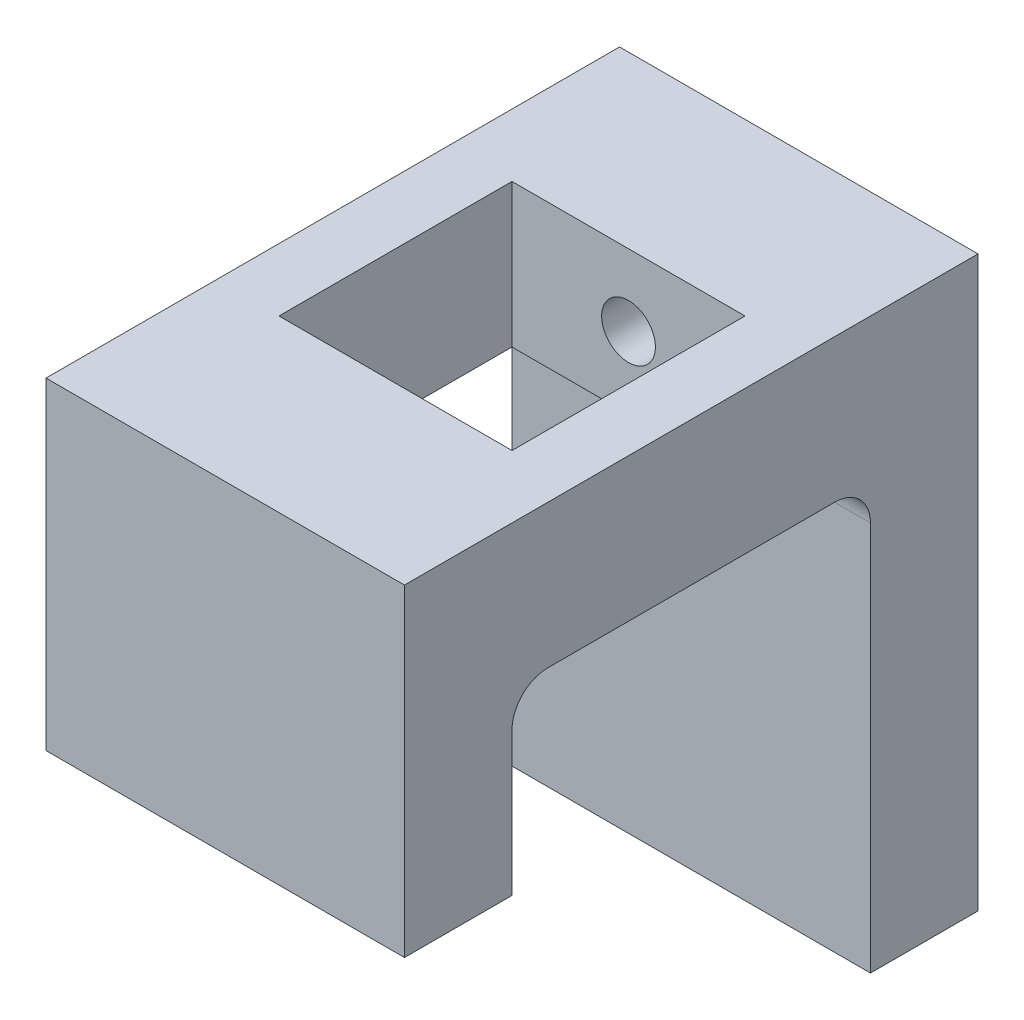
ISO-10303-21;
HEADER;
FILE_DESCRIPTION(('STEP AP214'),'2;1');
FILE_NAME('part.step','',(''),(''),'','','');
FILE_SCHEMA(('AUTOMOTIVE_DESIGN { 1 0 10303 214 1 1 1 1 }'));
ENDSEC;
DATA;
#1=APPLICATION_CONTEXT('core data for automotive mechanical design processes');
#2=APPLICATION_PROTOCOL_DEFINITION('international standard','automotive_design',2000,#1);
#3=PRODUCT_CONTEXT('',#1,'mechanical');
#4=PRODUCT('Part','Part','',(#3));
#5=PRODUCT_RELATED_PRODUCT_CATEGORY('part','',(#4));
#6=PRODUCT_DEFINITION_FORMATION('','',#4);
#7=PRODUCT_DEFINITION_CONTEXT('part definition',#1,'design');
#8=PRODUCT_DEFINITION('design','',#6,#7);
#9=PRODUCT_DEFINITION_SHAPE('','',#8);
#10=(LENGTH_UNIT() NAMED_UNIT(*) SI_UNIT(.MILLI.,.METRE.));
#11=(NAMED_UNIT(*) PLANE_ANGLE_UNIT() SI_UNIT($,.RADIAN.));
#12=(NAMED_UNIT(*) SI_UNIT($,.STERADIAN.) SOLID_ANGLE_UNIT());
#13=UNCERTAINTY_MEASURE_WITH_UNIT(LENGTH_MEASURE(1.E-05),#10,'distance_accuracy_value','');
#14=(GEOMETRIC_REPRESENTATION_CONTEXT(3) GLOBAL_UNCERTAINTY_ASSIGNED_CONTEXT((#13)) GLOBAL_UNIT_ASSIGNED_CONTEXT((#10,
#11,#12)) REPRESENTATION_CONTEXT('',''));
#15=CARTESIAN_POINT('',(0.,0.,0.));
#16=DIRECTION('',(0.,0.,1.));
#17=DIRECTION('',(1.,0.,0.));
#18=AXIS2_PLACEMENT_3D('',#15,#16,#17);
#19=CARTESIAN_POINT('',(-27.5,75.,3.));
#20=DIRECTION('',(0.,0.,-1.));
#21=DIRECTION('',(-1.,0.,0.));
#22=AXIS2_PLACEMENT_3D('',#19,#20,#21);
#23=PLANE('',#22);
#24=DIRECTION('',(0.,-1.,0.));
#25=VECTOR('',#24,1.);
#26=CARTESIAN_POINT('',(-27.5,75.,3.));
#27=LINE('',#26,#25);
#28=CARTESIAN_POINT('',(-27.5,65.,3.));
#29=VERTEX_POINT('',#28);
#30=CARTESIAN_POINT('',(-27.5,43.25,3.00000000000001));
#31=VERTEX_POINT('',#30);
#32=EDGE_CURVE('E152',#29,#31,#27,.T.);
#33=ORIENTED_EDGE('',*,*,#32,.T.);
#34=DIRECTION('',(1.,0.,0.));
#35=VECTOR('',#34,1.);
#36=CARTESIAN_POINT('',(-27.5,43.25,3.00000000000001));
#37=LINE('',#36,#35);
#38=CARTESIAN_POINT('',(-7.5,43.25,3.));
#39=VERTEX_POINT('',#38);
#40=EDGE_CURVE('E138',#31,#39,#37,.T.);
#41=ORIENTED_EDGE('',*,*,#40,.T.);
#42=DIRECTION('',(0.,-1.,0.));
#43=VECTOR('',#42,1.);
#44=CARTESIAN_POINT('',(-7.5,75.,3.));
#45=LINE('',#44,#43);
#46=CARTESIAN_POINT('',(-7.5,65.,3.));
#47=VERTEX_POINT('',#46);
#48=EDGE_CURVE('E163',#47,#39,#45,.T.);
#49=ORIENTED_EDGE('',*,*,#48,.F.);
#50=DIRECTION('',(1.,0.,0.));
#51=VECTOR('',#50,1.);
#52=CARTESIAN_POINT('',(-27.5,65.,3.));
#53=LINE('',#52,#51);
#54=EDGE_CURVE('E160',#47,#29,#53,.F.);
#55=ORIENTED_EDGE('',*,*,#54,.T.);
#56=EDGE_LOOP('',(#33,#41,#49,#55));
#57=FACE_BOUND('',#56,.T.);
#58=ADVANCED_FACE('F39',(#57),#23,.F.);
#59=CARTESIAN_POINT('',(-27.5,75.,-3.));
#60=DIRECTION('',(1.,0.,0.));
#61=DIRECTION('',(0.,0.,-1.));
#62=AXIS2_PLACEMENT_3D('',#59,#60,#61);
#63=PLANE('',#62);
#64=DIRECTION('',(0.,-1.,0.));
#65=VECTOR('',#64,1.);
#66=CARTESIAN_POINT('',(-27.5,75.,-3.));
#67=LINE('',#66,#65);
#68=CARTESIAN_POINT('',(-27.5,75.,-3.));
#69=VERTEX_POINT('',#68);
#70=CARTESIAN_POINT('',(-27.5,43.25,-3.));
#71=VERTEX_POINT('',#70);
#72=EDGE_CURVE('E156',#69,#71,#67,.T.);
#73=ORIENTED_EDGE('',*,*,#72,.T.);
#74=DIRECTION('',(0.,0.,1.));
#75=VECTOR('',#74,1.);
#76=CARTESIAN_POINT('',(-27.5,43.25,3.00000000000001));
#77=LINE('',#76,#75);
#78=EDGE_CURVE('E55',#71,#31,#77,.T.);
#79=ORIENTED_EDGE('',*,*,#78,.T.);
#80=ORIENTED_EDGE('',*,*,#32,.F.);
#81=CARTESIAN_POINT('',(-27.5,65.,5.));
#82=DIRECTION('',(1.,0.,0.));
#83=DIRECTION('',(0.,0.,-1.));
#84=AXIS2_PLACEMENT_3D('',#81,#82,#83);
#85=CIRCLE('',#84,2.);
#86=CARTESIAN_POINT('',(-27.5,67.,5.00000000000001));
#87=VERTEX_POINT('',#86);
#88=EDGE_CURVE('E11',#29,#87,#85,.T.);
#89=ORIENTED_EDGE('',*,*,#88,.T.);
#90=DIRECTION('',(0.,0.,-1.));
#91=VECTOR('',#90,1.);
#92=CARTESIAN_POINT('',(-27.5,67.,29.));
#93=LINE('',#92,#91);
#94=CARTESIAN_POINT('',(-27.5,67.,21.));
#95=VERTEX_POINT('',#94);
#96=EDGE_CURVE('E204',#95,#87,#93,.T.);
#97=ORIENTED_EDGE('',*,*,#96,.F.);
#98=CARTESIAN_POINT('',(-27.5,65.,21.));
#99=DIRECTION('',(1.,0.,0.));
#100=DIRECTION('',(0.,0.,-1.));
#101=AXIS2_PLACEMENT_3D('',#98,#99,#100);
#102=CIRCLE('',#101,2.);
#103=CARTESIAN_POINT('',(-27.5,65.,23.));
#104=VERTEX_POINT('',#103);
#105=EDGE_CURVE('E182',#95,#104,#102,.T.);
#106=ORIENTED_EDGE('',*,*,#105,.T.);
#107=DIRECTION('',(0.,1.,0.));
#108=VECTOR('',#107,1.);
#109=CARTESIAN_POINT('',(-27.5,57.,23.));
#110=LINE('',#109,#108);
#111=CARTESIAN_POINT('',(-27.5,57.,23.));
#112=VERTEX_POINT('',#111);
#113=EDGE_CURVE('E211',#112,#104,#110,.T.);
#114=ORIENTED_EDGE('',*,*,#113,.F.);
#115=DIRECTION('',(0.,0.,-1.));
#116=VECTOR('',#115,1.);
#117=CARTESIAN_POINT('',(-27.5,57.,29.));
#118=LINE('',#117,#116);
#119=CARTESIAN_POINT('',(-27.5,57.,29.));
#120=VERTEX_POINT('',#119);
#121=EDGE_CURVE('E320',#120,#112,#118,.T.);
#122=ORIENTED_EDGE('',*,*,#121,.F.);
#123=DIRECTION('',(0.,-1.,0.));
#124=VECTOR('',#123,1.);
#125=CARTESIAN_POINT('',(-27.5,75.,29.));
#126=LINE('',#125,#124);
#127=CARTESIAN_POINT('',(-27.5,75.,29.));
#128=VERTEX_POINT('',#127);
#129=EDGE_CURVE('E222',#128,#120,#126,.T.);
#130=ORIENTED_EDGE('',*,*,#129,.F.);
#131=DIRECTION('',(0.,0.,1.));
#132=VECTOR('',#131,1.);
#133=CARTESIAN_POINT('',(-27.5,75.,-3.));
#134=LINE('',#133,#132);
#135=EDGE_CURVE('E238',#69,#128,#134,.T.);
#136=ORIENTED_EDGE('',*,*,#135,.F.);
#137=EDGE_LOOP('',(#73,#79,#80,#89,#97,#106,#114,#122,#130,#136));
#138=FACE_BOUND('',#137,.T.);
#139=ADVANCED_FACE('F151',(#138),#63,.F.);
#140=CARTESIAN_POINT('',(-7.5,75.,-3.));
#141=DIRECTION('',(-1.,0.,0.));
#142=DIRECTION('',(0.,0.,1.));
#143=AXIS2_PLACEMENT_3D('',#140,#141,#142);
#144=PLANE('',#143);
#145=ORIENTED_EDGE('',*,*,#48,.T.);
#146=DIRECTION('',(0.,0.,1.));
#147=VECTOR('',#146,1.);
#148=CARTESIAN_POINT('',(-7.5,43.25,3.));
#149=LINE('',#148,#147);
#150=CARTESIAN_POINT('',(-7.5,43.25,-3.));
#151=VERTEX_POINT('',#150);
#152=EDGE_CURVE('E141',#151,#39,#149,.T.);
#153=ORIENTED_EDGE('',*,*,#152,.F.);
#154=DIRECTION('',(0.,-1.,0.));
#155=VECTOR('',#154,1.);
#156=CARTESIAN_POINT('',(-7.5,75.,-3.));
#157=LINE('',#156,#155);
#158=CARTESIAN_POINT('',(-7.5,75.,-3.));
#159=VERTEX_POINT('',#158);
#160=EDGE_CURVE('E170',#159,#151,#157,.T.);
#161=ORIENTED_EDGE('',*,*,#160,.F.);
#162=DIRECTION('',(0.,0.,-1.));
#163=VECTOR('',#162,1.);
#164=CARTESIAN_POINT('',(-7.5,75.,-3.));
#165=LINE('',#164,#163);
#166=CARTESIAN_POINT('',(-7.5,75.,29.));
#167=VERTEX_POINT('',#166);
#168=EDGE_CURVE('E241',#167,#159,#165,.T.);
#169=ORIENTED_EDGE('',*,*,#168,.F.);
#170=DIRECTION('',(0.,1.,0.));
#171=VECTOR('',#170,1.);
#172=CARTESIAN_POINT('',(-7.5,75.,29.));
#173=LINE('',#172,#171);
#174=CARTESIAN_POINT('',(-7.5,57.,29.));
#175=VERTEX_POINT('',#174);
#176=EDGE_CURVE('E229',#175,#167,#173,.T.);
#177=ORIENTED_EDGE('',*,*,#176,.F.);
#178=DIRECTION('',(0.,0.,-1.));
#179=VECTOR('',#178,1.);
#180=CARTESIAN_POINT('',(-7.5,57.,29.));
#181=LINE('',#180,#179);
#182=CARTESIAN_POINT('',(-7.5,57.,23.));
#183=VERTEX_POINT('',#182);
#184=EDGE_CURVE('E218',#175,#183,#181,.T.);
#185=ORIENTED_EDGE('',*,*,#184,.T.);
#186=DIRECTION('',(0.,1.,0.));
#187=VECTOR('',#186,1.);
#188=CARTESIAN_POINT('',(-7.5,57.,23.));
#189=LINE('',#188,#187);
#190=CARTESIAN_POINT('',(-7.5,65.,23.));
#191=VERTEX_POINT('',#190);
#192=EDGE_CURVE('E194',#183,#191,#189,.T.);
#193=ORIENTED_EDGE('',*,*,#192,.T.);
#194=CARTESIAN_POINT('',(-7.49999999999999,65.,21.));
#195=DIRECTION('',(-1.,0.,0.));
#196=DIRECTION('',(0.,0.,1.));
#197=AXIS2_PLACEMENT_3D('',#194,#195,#196);
#198=CIRCLE('',#197,2.);
#199=CARTESIAN_POINT('',(-7.5,67.,21.));
#200=VERTEX_POINT('',#199);
#201=EDGE_CURVE('E185',#191,#200,#198,.T.);
#202=ORIENTED_EDGE('',*,*,#201,.T.);
#203=DIRECTION('',(0.,0.,-1.));
#204=VECTOR('',#203,1.);
#205=CARTESIAN_POINT('',(-7.5,67.,29.));
#206=LINE('',#205,#204);
#207=CARTESIAN_POINT('',(-7.5,67.,5.00000000000001));
#208=VERTEX_POINT('',#207);
#209=EDGE_CURVE('E192',#200,#208,#206,.T.);
#210=ORIENTED_EDGE('',*,*,#209,.T.);
#211=CARTESIAN_POINT('',(-7.5,65.,5.));
#212=DIRECTION('',(-1.,0.,0.));
#213=DIRECTION('',(0.,0.,1.));
#214=AXIS2_PLACEMENT_3D('',#211,#212,#213);
#215=CIRCLE('',#214,2.);
#216=EDGE_CURVE('E48',#208,#47,#215,.T.);
#217=ORIENTED_EDGE('',*,*,#216,.T.);
#218=EDGE_LOOP('',(#145,#153,#161,#169,#177,#185,#193,#202,#210,#217));
#219=FACE_BOUND('',#218,.T.);
#220=ADVANCED_FACE('F191',(#219),#144,.F.);
#221=CARTESIAN_POINT('',(-27.5,75.,-3.));
#222=DIRECTION('',(0.,0.,1.));
#223=DIRECTION('',(1.,0.,0.));
#224=AXIS2_PLACEMENT_3D('',#221,#222,#223);
#225=PLANE('',#224);
#226=ORIENTED_EDGE('',*,*,#160,.T.);
#227=DIRECTION('',(1.,0.,0.));
#228=VECTOR('',#227,1.);
#229=CARTESIAN_POINT('',(-27.5,43.25,-2.99999999999999));
#230=LINE('',#229,#228);
#231=EDGE_CURVE('E146',#71,#151,#230,.T.);
#232=ORIENTED_EDGE('',*,*,#231,.F.);
#233=ORIENTED_EDGE('',*,*,#72,.F.);
#234=DIRECTION('',(-1.,0.,0.));
#235=VECTOR('',#234,1.);
#236=CARTESIAN_POINT('',(-27.5,75.,-3.));
#237=LINE('',#236,#235);
#238=EDGE_CURVE('E244',#159,#69,#237,.T.);
#239=ORIENTED_EDGE('',*,*,#238,.F.);
#240=EDGE_LOOP('',(#226,#232,#233,#239));
#241=FACE_BOUND('',#240,.T.);
#242=ADVANCED_FACE('F253',(#241),#225,.F.);
#243=CARTESIAN_POINT('',(0.,75.,0.));
#244=DIRECTION('',(0.,1.,0.));
#245=DIRECTION('',(0.,0.,1.));
#246=AXIS2_PLACEMENT_3D('',#243,#244,#245);
#247=PLANE('',#246);
#248=DIRECTION('',(0.,0.,1.));
#249=VECTOR('',#248,1.);
#250=CARTESIAN_POINT('',(-11.,75.,19.5));
#251=LINE('',#250,#249);
#252=CARTESIAN_POINT('',(-11.,75.,6.5));
#253=VERTEX_POINT('',#252);
#254=CARTESIAN_POINT('',(-11.,75.,19.5));
#255=VERTEX_POINT('',#254);
#256=EDGE_CURVE('E275',#253,#255,#251,.T.);
#257=ORIENTED_EDGE('',*,*,#256,.T.);
#258=DIRECTION('',(-1.,0.,0.));
#259=VECTOR('',#258,1.);
#260=CARTESIAN_POINT('',(-24.,75.,19.5));
#261=LINE('',#260,#259);
#262=CARTESIAN_POINT('',(-24.,75.,19.5));
#263=VERTEX_POINT('',#262);
#264=EDGE_CURVE('E279',#255,#263,#261,.T.);
#265=ORIENTED_EDGE('',*,*,#264,.T.);
#266=DIRECTION('',(0.,0.,-1.));
#267=VECTOR('',#266,1.);
#268=CARTESIAN_POINT('',(-24.,75.,19.5));
#269=LINE('',#268,#267);
#270=CARTESIAN_POINT('',(-24.,75.,6.5));
#271=VERTEX_POINT('',#270);
#272=EDGE_CURVE('E284',#263,#271,#269,.T.);
#273=ORIENTED_EDGE('',*,*,#272,.T.);
#274=DIRECTION('',(1.,0.,0.));
#275=VECTOR('',#274,1.);
#276=CARTESIAN_POINT('',(-24.,75.,6.5));
#277=LINE('',#276,#275);
#278=EDGE_CURVE('E288',#271,#253,#277,.T.);
#279=ORIENTED_EDGE('',*,*,#278,.T.);
#280=EDGE_LOOP('',(#257,#265,#273,#279));
#281=FACE_BOUND('',#280,.T.);
#282=ORIENTED_EDGE('',*,*,#135,.T.);
#283=DIRECTION('',(-1.,0.,0.));
#284=VECTOR('',#283,1.);
#285=CARTESIAN_POINT('',(-27.5,75.,29.));
#286=LINE('',#285,#284);
#287=EDGE_CURVE('E205',#167,#128,#286,.T.);
#288=ORIENTED_EDGE('',*,*,#287,.F.);
#289=ORIENTED_EDGE('',*,*,#168,.T.);
#290=ORIENTED_EDGE('',*,*,#238,.T.);
#291=EDGE_LOOP('',(#282,#288,#289,#290));
#292=FACE_BOUND('',#291,.T.);
#293=ADVANCED_FACE('F334',(#281,#292),#247,.T.);
#294=CARTESIAN_POINT('',(-27.5,67.,29.));
#295=DIRECTION('',(0.,1.,0.));
#296=DIRECTION('',(0.,0.,1.));
#297=AXIS2_PLACEMENT_3D('',#294,#295,#296);
#298=PLANE('',#297);
#299=DIRECTION('',(-1.,0.,0.));
#300=VECTOR('',#299,1.);
#301=CARTESIAN_POINT('',(-24.,67.,19.5));
#302=LINE('',#301,#300);
#303=CARTESIAN_POINT('',(-11.,67.,19.5));
#304=VERTEX_POINT('',#303);
#305=CARTESIAN_POINT('',(-24.,67.,19.5));
#306=VERTEX_POINT('',#305);
#307=EDGE_CURVE('E295',#304,#306,#302,.T.);
#308=ORIENTED_EDGE('',*,*,#307,.F.);
#309=DIRECTION('',(0.,0.,1.));
#310=VECTOR('',#309,1.);
#311=CARTESIAN_POINT('',(-11.,67.,19.5));
#312=LINE('',#311,#310);
#313=CARTESIAN_POINT('',(-11.,67.,6.5));
#314=VERTEX_POINT('',#313);
#315=EDGE_CURVE('E271',#314,#304,#312,.T.);
#316=ORIENTED_EDGE('',*,*,#315,.F.);
#317=DIRECTION('',(1.,0.,0.));
#318=VECTOR('',#317,1.);
#319=CARTESIAN_POINT('',(-24.,67.,6.5));
#320=LINE('',#319,#318);
#321=CARTESIAN_POINT('',(-24.,67.,6.5));
#322=VERTEX_POINT('',#321);
#323=EDGE_CURVE('E280',#322,#314,#320,.T.);
#324=ORIENTED_EDGE('',*,*,#323,.F.);
#325=DIRECTION('',(0.,0.,-1.));
#326=VECTOR('',#325,1.);
#327=CARTESIAN_POINT('',(-24.,67.,19.5));
#328=LINE('',#327,#326);
#329=EDGE_CURVE('E299',#306,#322,#328,.T.);
#330=ORIENTED_EDGE('',*,*,#329,.F.);
#331=EDGE_LOOP('',(#308,#316,#324,#330));
#332=FACE_BOUND('',#331,.T.);
#333=ORIENTED_EDGE('',*,*,#209,.F.);
#334=DIRECTION('',(-1.,0.,0.));
#335=VECTOR('',#334,1.);
#336=CARTESIAN_POINT('',(-27.5,67.,21.));
#337=LINE('',#336,#335);
#338=EDGE_CURVE('E168',#200,#95,#337,.T.);
#339=ORIENTED_EDGE('',*,*,#338,.T.);
#340=ORIENTED_EDGE('',*,*,#96,.T.);
#341=DIRECTION('',(1.,0.,0.));
#342=VECTOR('',#341,1.);
#343=CARTESIAN_POINT('',(-7.5,67.,5.));
#344=LINE('',#343,#342);
#345=EDGE_CURVE('E162',#87,#208,#344,.T.);
#346=ORIENTED_EDGE('',*,*,#345,.T.);
#347=EDGE_LOOP('',(#333,#339,#340,#346));
#348=FACE_BOUND('',#347,.T.);
#349=ADVANCED_FACE('F199',(#332,#348),#298,.F.);
#350=CARTESIAN_POINT('',(0.,0.,29.));
#351=DIRECTION('',(0.,0.,1.));
#352=DIRECTION('',(1.,0.,0.));
#353=AXIS2_PLACEMENT_3D('',#350,#351,#352);
#354=PLANE('',#353);
#355=ORIENTED_EDGE('',*,*,#129,.T.);
#356=DIRECTION('',(-1.,0.,0.));
#357=VECTOR('',#356,1.);
#358=CARTESIAN_POINT('',(-7.5,57.,29.));
#359=LINE('',#358,#357);
#360=EDGE_CURVE('E224',#175,#120,#359,.T.);
#361=ORIENTED_EDGE('',*,*,#360,.F.);
#362=ORIENTED_EDGE('',*,*,#176,.T.);
#363=ORIENTED_EDGE('',*,*,#287,.T.);
#364=EDGE_LOOP('',(#355,#361,#362,#363));
#365=FACE_BOUND('',#364,.T.);
#366=ADVANCED_FACE('F331',(#365),#354,.T.);
#367=CARTESIAN_POINT('',(-7.5,57.,23.));
#368=DIRECTION('',(0.,0.,-1.));
#369=DIRECTION('',(-1.,0.,0.));
#370=AXIS2_PLACEMENT_3D('',#367,#368,#369);
#371=PLANE('',#370);
#372=ORIENTED_EDGE('',*,*,#113,.T.);
#373=DIRECTION('',(-1.,0.,0.));
#374=VECTOR('',#373,1.);
#375=CARTESIAN_POINT('',(-7.5,65.,23.));
#376=LINE('',#375,#374);
#377=EDGE_CURVE('E177',#104,#191,#376,.F.);
#378=ORIENTED_EDGE('',*,*,#377,.T.);
#379=ORIENTED_EDGE('',*,*,#192,.F.);
#380=DIRECTION('',(-1.,0.,0.));
#381=VECTOR('',#380,1.);
#382=CARTESIAN_POINT('',(-7.5,57.,23.));
#383=LINE('',#382,#381);
#384=EDGE_CURVE('E216',#183,#112,#383,.T.);
#385=ORIENTED_EDGE('',*,*,#384,.T.);
#386=EDGE_LOOP('',(#372,#378,#379,#385));
#387=FACE_BOUND('',#386,.T.);
#388=ADVANCED_FACE('F214',(#387),#371,.T.);
#389=CARTESIAN_POINT('',(0.,57.,0.));
#390=DIRECTION('',(0.,-1.,0.));
#391=DIRECTION('',(0.,0.,-1.));
#392=AXIS2_PLACEMENT_3D('',#389,#390,#391);
#393=PLANE('',#392);
#394=ORIENTED_EDGE('',*,*,#384,.F.);
#395=ORIENTED_EDGE('',*,*,#184,.F.);
#396=ORIENTED_EDGE('',*,*,#360,.T.);
#397=ORIENTED_EDGE('',*,*,#121,.T.);
#398=EDGE_LOOP('',(#394,#395,#396,#397));
#399=FACE_BOUND('',#398,.T.);
#400=ADVANCED_FACE('F328',(#399),#393,.T.);
#401=CARTESIAN_POINT('',(-11.,75.,19.5));
#402=DIRECTION('',(1.,0.,0.));
#403=DIRECTION('',(0.,0.,-1.));
#404=AXIS2_PLACEMENT_3D('',#401,#402,#403);
#405=PLANE('',#404);
#406=ORIENTED_EDGE('',*,*,#315,.T.);
#407=DIRECTION('',(0.,-1.,0.));
#408=VECTOR('',#407,1.);
#409=CARTESIAN_POINT('',(-11.,75.,19.5));
#410=LINE('',#409,#408);
#411=EDGE_CURVE('E292',#255,#304,#410,.T.);
#412=ORIENTED_EDGE('',*,*,#411,.F.);
#413=ORIENTED_EDGE('',*,*,#256,.F.);
#414=DIRECTION('',(0.,-1.,0.));
#415=VECTOR('',#414,1.);
#416=CARTESIAN_POINT('',(-11.,75.,6.5));
#417=LINE('',#416,#415);
#418=EDGE_CURVE('E306',#253,#314,#417,.T.);
#419=ORIENTED_EDGE('',*,*,#418,.T.);
#420=EDGE_LOOP('',(#406,#412,#413,#419));
#421=FACE_BOUND('',#420,.T.);
#422=ADVANCED_FACE('F384',(#421),#405,.F.);
#423=CARTESIAN_POINT('',(-24.,75.,6.5));
#424=DIRECTION('',(0.,0.,-1.));
#425=DIRECTION('',(-1.,0.,0.));
#426=AXIS2_PLACEMENT_3D('',#423,#424,#425);
#427=PLANE('',#426);
#428=CARTESIAN_POINT('',(-17.5,71.,6.5));
#429=DIRECTION('',(0.,0.,1.));
#430=DIRECTION('',(1.,0.,0.));
#431=AXIS2_PLACEMENT_3D('',#428,#429,#430);
#432=CIRCLE('',#431,1.5);
#433=CARTESIAN_POINT('',(-16.,71.,6.5));
#434=VERTEX_POINT('',#433);
#435=EDGE_CURVE('E263',#434,#434,#432,.T.);
#436=ORIENTED_EDGE('',*,*,#435,.F.);
#437=EDGE_LOOP('',(#436));
#438=FACE_BOUND('',#437,.T.);
#439=ORIENTED_EDGE('',*,*,#323,.T.);
#440=ORIENTED_EDGE('',*,*,#418,.F.);
#441=ORIENTED_EDGE('',*,*,#278,.F.);
#442=DIRECTION('',(0.,-1.,0.));
#443=VECTOR('',#442,1.);
#444=CARTESIAN_POINT('',(-24.,75.,6.5));
#445=LINE('',#444,#443);
#446=EDGE_CURVE('E309',#271,#322,#445,.T.);
#447=ORIENTED_EDGE('',*,*,#446,.T.);
#448=EDGE_LOOP('',(#439,#440,#441,#447));
#449=FACE_BOUND('',#448,.T.);
#450=ADVANCED_FACE('F380',(#438,#449),#427,.F.);
#451=CARTESIAN_POINT('',(-24.,75.,19.5));
#452=DIRECTION('',(-1.,0.,0.));
#453=DIRECTION('',(0.,0.,1.));
#454=AXIS2_PLACEMENT_3D('',#451,#452,#453);
#455=PLANE('',#454);
#456=ORIENTED_EDGE('',*,*,#329,.T.);
#457=ORIENTED_EDGE('',*,*,#446,.F.);
#458=ORIENTED_EDGE('',*,*,#272,.F.);
#459=DIRECTION('',(0.,-1.,0.));
#460=VECTOR('',#459,1.);
#461=CARTESIAN_POINT('',(-24.,75.,19.5));
#462=LINE('',#461,#460);
#463=EDGE_CURVE('E312',#263,#306,#462,.T.);
#464=ORIENTED_EDGE('',*,*,#463,.T.);
#465=EDGE_LOOP('',(#456,#457,#458,#464));
#466=FACE_BOUND('',#465,.T.);
#467=ADVANCED_FACE('F383',(#466),#455,.F.);
#468=CARTESIAN_POINT('',(-24.,75.,19.5));
#469=DIRECTION('',(0.,0.,1.));
#470=DIRECTION('',(1.,0.,0.));
#471=AXIS2_PLACEMENT_3D('',#468,#469,#470);
#472=PLANE('',#471);
#473=CARTESIAN_POINT('',(-17.5,71.,19.5));
#474=DIRECTION('',(0.,0.,-1.));
#475=DIRECTION('',(-1.,0.,0.));
#476=AXIS2_PLACEMENT_3D('',#473,#474,#475);
#477=CIRCLE('',#476,1.5);
#478=CARTESIAN_POINT('',(-19.,71.,19.5));
#479=VERTEX_POINT('',#478);
#480=EDGE_CURVE('E145',#479,#479,#477,.T.);
#481=ORIENTED_EDGE('',*,*,#480,.F.);
#482=EDGE_LOOP('',(#481));
#483=FACE_BOUND('',#482,.T.);
#484=ORIENTED_EDGE('',*,*,#307,.T.);
#485=ORIENTED_EDGE('',*,*,#463,.F.);
#486=ORIENTED_EDGE('',*,*,#264,.F.);
#487=ORIENTED_EDGE('',*,*,#411,.T.);
#488=EDGE_LOOP('',(#484,#485,#486,#487));
#489=FACE_BOUND('',#488,.T.);
#490=ADVANCED_FACE('F378',(#483,#489),#472,.F.);
#491=CARTESIAN_POINT('',(-17.5,71.,1.5));
#492=DIRECTION('',(0.,0.,1.));
#493=DIRECTION('',(1.,0.,0.));
#494=AXIS2_PLACEMENT_3D('',#491,#492,#493);
#495=CYLINDRICAL_SURFACE('',#494,1.5);
#496=CARTESIAN_POINT('',(-17.5,71.,1.5));
#497=DIRECTION('',(0.,0.,1.));
#498=DIRECTION('',(1.,0.,0.));
#499=AXIS2_PLACEMENT_3D('',#496,#497,#498);
#500=CIRCLE('',#499,1.5);
#501=CARTESIAN_POINT('',(-16.,71.,1.5));
#502=VERTEX_POINT('',#501);
#503=EDGE_CURVE('E267',#502,#502,#500,.T.);
#504=ORIENTED_EDGE('',*,*,#503,.F.);
#505=EDGE_LOOP('',(#504));
#506=FACE_BOUND('',#505,.T.);
#507=ORIENTED_EDGE('',*,*,#435,.T.);
#508=EDGE_LOOP('',(#507));
#509=FACE_BOUND('',#508,.T.);
#510=ADVANCED_FACE('F374',(#506,#509),#495,.F.);
#511=CARTESIAN_POINT('',(-17.5,71.,1.5));
#512=DIRECTION('',(0.,0.,1.));
#513=DIRECTION('',(1.,0.,0.));
#514=AXIS2_PLACEMENT_3D('',#511,#512,#513);
#515=PLANE('',#514);
#516=ORIENTED_EDGE('',*,*,#503,.T.);
#517=EDGE_LOOP('',(#516));
#518=FACE_BOUND('',#517,.T.);
#519=ADVANCED_FACE('F367',(#518),#515,.T.);
#520=CARTESIAN_POINT('',(-17.5,71.,24.5));
#521=DIRECTION('',(0.,0.,-1.));
#522=DIRECTION('',(-1.,0.,0.));
#523=AXIS2_PLACEMENT_3D('',#520,#521,#522);
#524=CYLINDRICAL_SURFACE('',#523,1.5);
#525=CARTESIAN_POINT('',(-17.5,71.,24.5));
#526=DIRECTION('',(0.,0.,-1.));
#527=DIRECTION('',(-1.,0.,0.));
#528=AXIS2_PLACEMENT_3D('',#525,#526,#527);
#529=CIRCLE('',#528,1.5);
#530=CARTESIAN_POINT('',(-19.,71.,24.5));
#531=VERTEX_POINT('',#530);
#532=EDGE_CURVE('E259',#531,#531,#529,.T.);
#533=ORIENTED_EDGE('',*,*,#532,.F.);
#534=EDGE_LOOP('',(#533));
#535=FACE_BOUND('',#534,.T.);
#536=ORIENTED_EDGE('',*,*,#480,.T.);
#537=EDGE_LOOP('',(#536));
#538=FACE_BOUND('',#537,.T.);
#539=ADVANCED_FACE('F361',(#535,#538),#524,.F.);
#540=CARTESIAN_POINT('',(-17.5,71.,24.5));
#541=DIRECTION('',(0.,0.,-1.));
#542=DIRECTION('',(-1.,0.,0.));
#543=AXIS2_PLACEMENT_3D('',#540,#541,#542);
#544=PLANE('',#543);
#545=ORIENTED_EDGE('',*,*,#532,.T.);
#546=EDGE_LOOP('',(#545));
#547=FACE_BOUND('',#546,.T.);
#548=ADVANCED_FACE('F355',(#547),#544,.T.);
#549=CARTESIAN_POINT('',(-27.5,65.,21.));
#550=DIRECTION('',(-1.,0.,0.));
#551=DIRECTION('',(0.,0.,1.));
#552=AXIS2_PLACEMENT_3D('',#549,#550,#551);
#553=CYLINDRICAL_SURFACE('',#552,2.);
#554=ORIENTED_EDGE('',*,*,#201,.F.);
#555=ORIENTED_EDGE('',*,*,#377,.F.);
#556=ORIENTED_EDGE('',*,*,#105,.F.);
#557=ORIENTED_EDGE('',*,*,#338,.F.);
#558=EDGE_LOOP('',(#554,#555,#556,#557));
#559=FACE_BOUND('',#558,.T.);
#560=ADVANCED_FACE('F207',(#559),#553,.F.);
#561=CARTESIAN_POINT('',(-27.5,65.,5.));
#562=DIRECTION('',(-1.,0.,0.));
#563=DIRECTION('',(0.,0.,1.));
#564=AXIS2_PLACEMENT_3D('',#561,#562,#563);
#565=CYLINDRICAL_SURFACE('',#564,2.);
#566=ORIENTED_EDGE('',*,*,#88,.F.);
#567=ORIENTED_EDGE('',*,*,#54,.F.);
#568=ORIENTED_EDGE('',*,*,#216,.F.);
#569=ORIENTED_EDGE('',*,*,#345,.F.);
#570=EDGE_LOOP('',(#566,#567,#568,#569));
#571=FACE_BOUND('',#570,.T.);
#572=ADVANCED_FACE('F41',(#571),#565,.F.);
#573=CARTESIAN_POINT('',(-27.5,43.25,3.00000000000001));
#574=DIRECTION('',(0.,1.,0.));
#575=DIRECTION('',(0.,0.,1.));
#576=AXIS2_PLACEMENT_3D('',#573,#574,#575);
#577=PLANE('',#576);
#578=ORIENTED_EDGE('',*,*,#152,.T.);
#579=ORIENTED_EDGE('',*,*,#40,.F.);
#580=ORIENTED_EDGE('',*,*,#78,.F.);
#581=ORIENTED_EDGE('',*,*,#231,.T.);
#582=EDGE_LOOP('',(#578,#579,#580,#581));
#583=FACE_BOUND('',#582,.T.);
#584=ADVANCED_FACE('F139',(#583),#577,.F.);
#585=CLOSED_SHELL('',(#58,#139,#220,#242,#293,#349,#366,#388,#400,#422,#450,#467,#490,#510,#519,
#539,#548,#560,#572,#584));
#586=MANIFOLD_SOLID_BREP('B2',#585);
#587=ADVANCED_BREP_SHAPE_REPRESENTATION('',(#18,#586),#14);
#588=SHAPE_DEFINITION_REPRESENTATION(#9,#587);
ENDSEC;
END-ISO-10303-21;
